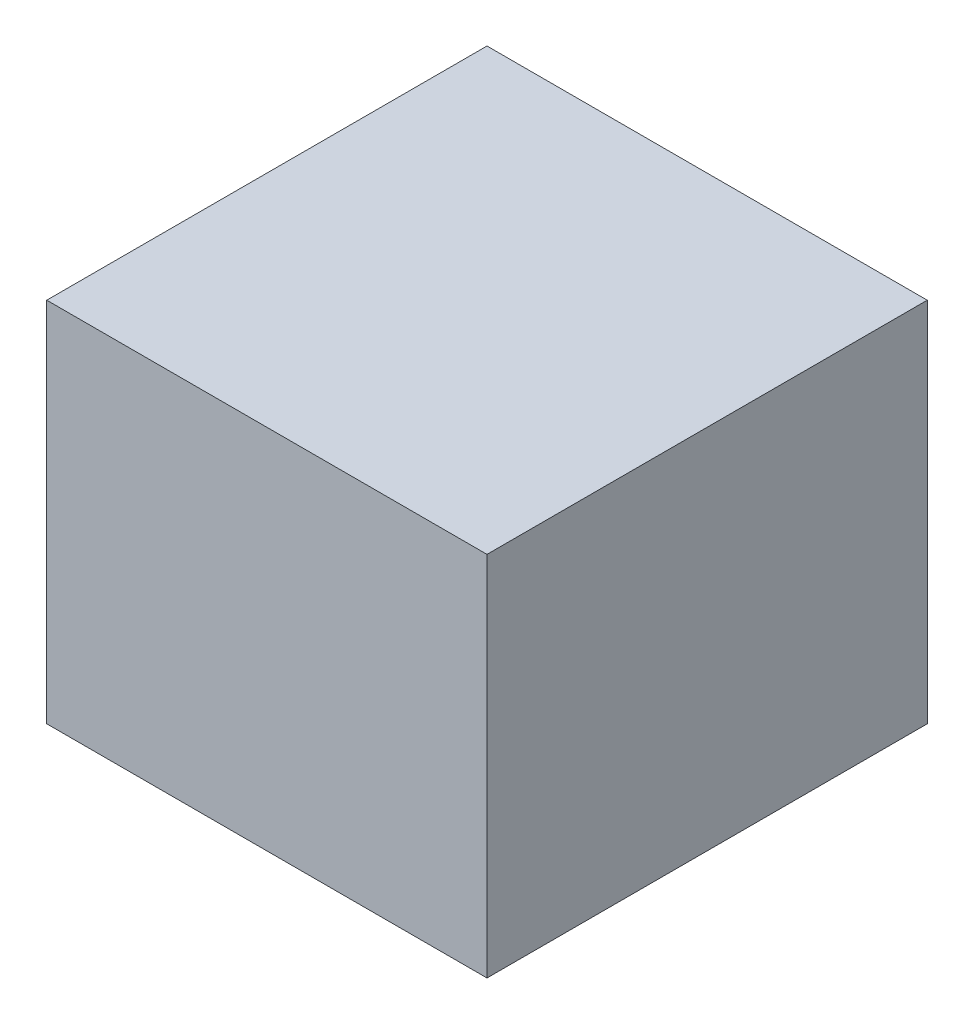
ISO-10303-21;
HEADER;
FILE_DESCRIPTION(('STEP AP214'),'2;1');
FILE_NAME('part.step','',(''),(''),'','','');
FILE_SCHEMA(('AUTOMOTIVE_DESIGN { 1 0 10303 214 1 1 1 1 }'));
ENDSEC;
DATA;
#1=APPLICATION_CONTEXT('core data for automotive mechanical design processes');
#2=APPLICATION_PROTOCOL_DEFINITION('international standard','automotive_design',2000,#1);
#3=PRODUCT_CONTEXT('',#1,'mechanical');
#4=PRODUCT('Part','Part','',(#3));
#5=PRODUCT_RELATED_PRODUCT_CATEGORY('part','',(#4));
#6=PRODUCT_DEFINITION_FORMATION('','',#4);
#7=PRODUCT_DEFINITION_CONTEXT('part definition',#1,'design');
#8=PRODUCT_DEFINITION('design','',#6,#7);
#9=PRODUCT_DEFINITION_SHAPE('','',#8);
#10=(LENGTH_UNIT() NAMED_UNIT(*) SI_UNIT(.MILLI.,.METRE.));
#11=(NAMED_UNIT(*) PLANE_ANGLE_UNIT() SI_UNIT($,.RADIAN.));
#12=(NAMED_UNIT(*) SI_UNIT($,.STERADIAN.) SOLID_ANGLE_UNIT());
#13=UNCERTAINTY_MEASURE_WITH_UNIT(LENGTH_MEASURE(1.E-05),#10,'distance_accuracy_value','');
#14=(GEOMETRIC_REPRESENTATION_CONTEXT(3) GLOBAL_UNCERTAINTY_ASSIGNED_CONTEXT((#13)) GLOBAL_UNIT_ASSIGNED_CONTEXT((#10,
#11,#12)) REPRESENTATION_CONTEXT('',''));
#15=CARTESIAN_POINT('',(0.,0.,0.));
#16=DIRECTION('',(0.,0.,1.));
#17=DIRECTION('',(1.,0.,0.));
#18=AXIS2_PLACEMENT_3D('',#15,#16,#17);
#19=CARTESIAN_POINT('',(0.,25.,0.));
#20=DIRECTION('',(1.,0.,0.));
#21=DIRECTION('',(0.,0.,-1.));
#22=AXIS2_PLACEMENT_3D('',#19,#20,#21);
#23=PLANE('',#22);
#24=DIRECTION('',(0.,0.,1.));
#25=VECTOR('',#24,1.);
#26=CARTESIAN_POINT('',(0.,0.,0.));
#27=LINE('',#26,#25);
#28=CARTESIAN_POINT('',(0.,0.,0.));
#29=VERTEX_POINT('',#28);
#30=CARTESIAN_POINT('',(0.,0.,30.));
#31=VERTEX_POINT('',#30);
#32=EDGE_CURVE('E107',#29,#31,#27,.T.);
#33=ORIENTED_EDGE('',*,*,#32,.T.);
#34=DIRECTION('',(0.,-1.,0.));
#35=VECTOR('',#34,1.);
#36=CARTESIAN_POINT('',(0.,25.,30.));
#37=LINE('',#36,#35);
#38=CARTESIAN_POINT('',(0.,25.,30.));
#39=VERTEX_POINT('',#38);
#40=EDGE_CURVE('E11',#39,#31,#37,.T.);
#41=ORIENTED_EDGE('',*,*,#40,.F.);
#42=DIRECTION('',(0.,0.,1.));
#43=VECTOR('',#42,1.);
#44=CARTESIAN_POINT('',(0.,25.,0.));
#45=LINE('',#44,#43);
#46=CARTESIAN_POINT('',(0.,25.,0.));
#47=VERTEX_POINT('',#46);
#48=EDGE_CURVE('E91',#47,#39,#45,.T.);
#49=ORIENTED_EDGE('',*,*,#48,.F.);
#50=DIRECTION('',(0.,-1.,0.));
#51=VECTOR('',#50,1.);
#52=CARTESIAN_POINT('',(0.,25.,0.));
#53=LINE('',#52,#51);
#54=EDGE_CURVE('E103',#47,#29,#53,.T.);
#55=ORIENTED_EDGE('',*,*,#54,.T.);
#56=EDGE_LOOP('',(#33,#41,#49,#55));
#57=FACE_BOUND('',#56,.T.);
#58=ADVANCED_FACE('F39',(#57),#23,.F.);
#59=CARTESIAN_POINT('',(0.,25.,30.));
#60=DIRECTION('',(0.,0.,-1.));
#61=DIRECTION('',(-1.,0.,0.));
#62=AXIS2_PLACEMENT_3D('',#59,#60,#61);
#63=PLANE('',#62);
#64=DIRECTION('',(1.,0.,0.));
#65=VECTOR('',#64,1.);
#66=CARTESIAN_POINT('',(0.,0.,30.));
#67=LINE('',#66,#65);
#68=CARTESIAN_POINT('',(30.,0.,30.));
#69=VERTEX_POINT('',#68);
#70=EDGE_CURVE('E96',#31,#69,#67,.T.);
#71=ORIENTED_EDGE('',*,*,#70,.T.);
#72=DIRECTION('',(0.,-1.,0.));
#73=VECTOR('',#72,1.);
#74=CARTESIAN_POINT('',(30.,25.,30.));
#75=LINE('',#74,#73);
#76=CARTESIAN_POINT('',(30.,25.,30.));
#77=VERTEX_POINT('',#76);
#78=EDGE_CURVE('E48',#77,#69,#75,.T.);
#79=ORIENTED_EDGE('',*,*,#78,.F.);
#80=DIRECTION('',(1.,0.,0.));
#81=VECTOR('',#80,1.);
#82=CARTESIAN_POINT('',(0.,25.,30.));
#83=LINE('',#82,#81);
#84=EDGE_CURVE('E86',#39,#77,#83,.T.);
#85=ORIENTED_EDGE('',*,*,#84,.F.);
#86=ORIENTED_EDGE('',*,*,#40,.T.);
#87=EDGE_LOOP('',(#71,#79,#85,#86));
#88=FACE_BOUND('',#87,.T.);
#89=ADVANCED_FACE('F95',(#88),#63,.F.);
#90=CARTESIAN_POINT('',(30.,25.,0.));
#91=DIRECTION('',(-1.,0.,0.));
#92=DIRECTION('',(0.,0.,1.));
#93=AXIS2_PLACEMENT_3D('',#90,#91,#92);
#94=PLANE('',#93);
#95=DIRECTION('',(0.,0.,-1.));
#96=VECTOR('',#95,1.);
#97=CARTESIAN_POINT('',(30.,0.,0.));
#98=LINE('',#97,#96);
#99=CARTESIAN_POINT('',(30.,0.,0.));
#100=VERTEX_POINT('',#99);
#101=EDGE_CURVE('E73',#69,#100,#98,.T.);
#102=ORIENTED_EDGE('',*,*,#101,.T.);
#103=DIRECTION('',(0.,-1.,0.));
#104=VECTOR('',#103,1.);
#105=CARTESIAN_POINT('',(30.,25.,0.));
#106=LINE('',#105,#104);
#107=CARTESIAN_POINT('',(30.,25.,0.));
#108=VERTEX_POINT('',#107);
#109=EDGE_CURVE('E98',#108,#100,#106,.T.);
#110=ORIENTED_EDGE('',*,*,#109,.F.);
#111=DIRECTION('',(0.,0.,-1.));
#112=VECTOR('',#111,1.);
#113=CARTESIAN_POINT('',(30.,25.,0.));
#114=LINE('',#113,#112);
#115=EDGE_CURVE('E89',#77,#108,#114,.T.);
#116=ORIENTED_EDGE('',*,*,#115,.F.);
#117=ORIENTED_EDGE('',*,*,#78,.T.);
#118=EDGE_LOOP('',(#102,#110,#116,#117));
#119=FACE_BOUND('',#118,.T.);
#120=ADVANCED_FACE('F99',(#119),#94,.F.);
#121=CARTESIAN_POINT('',(0.,25.,0.));
#122=DIRECTION('',(0.,0.,1.));
#123=DIRECTION('',(1.,0.,0.));
#124=AXIS2_PLACEMENT_3D('',#121,#122,#123);
#125=PLANE('',#124);
#126=DIRECTION('',(-1.,0.,0.));
#127=VECTOR('',#126,1.);
#128=CARTESIAN_POINT('',(0.,0.,0.));
#129=LINE('',#128,#127);
#130=EDGE_CURVE('E79',#100,#29,#129,.T.);
#131=ORIENTED_EDGE('',*,*,#130,.T.);
#132=ORIENTED_EDGE('',*,*,#54,.F.);
#133=DIRECTION('',(-1.,0.,0.));
#134=VECTOR('',#133,1.);
#135=CARTESIAN_POINT('',(0.,25.,0.));
#136=LINE('',#135,#134);
#137=EDGE_CURVE('E56',#108,#47,#136,.T.);
#138=ORIENTED_EDGE('',*,*,#137,.F.);
#139=ORIENTED_EDGE('',*,*,#109,.T.);
#140=EDGE_LOOP('',(#131,#132,#138,#139));
#141=FACE_BOUND('',#140,.T.);
#142=ADVANCED_FACE('F120',(#141),#125,.F.);
#143=CARTESIAN_POINT('',(0.,25.,0.));
#144=DIRECTION('',(0.,1.,0.));
#145=DIRECTION('',(0.,0.,1.));
#146=AXIS2_PLACEMENT_3D('',#143,#144,#145);
#147=PLANE('',#146);
#148=ORIENTED_EDGE('',*,*,#48,.T.);
#149=ORIENTED_EDGE('',*,*,#84,.T.);
#150=ORIENTED_EDGE('',*,*,#115,.T.);
#151=ORIENTED_EDGE('',*,*,#137,.T.);
#152=EDGE_LOOP('',(#148,#149,#150,#151));
#153=FACE_BOUND('',#152,.T.);
#154=ADVANCED_FACE('F87',(#153),#147,.T.);
#155=CARTESIAN_POINT('',(0.,0.,0.));
#156=DIRECTION('',(0.,1.,0.));
#157=DIRECTION('',(0.,0.,1.));
#158=AXIS2_PLACEMENT_3D('',#155,#156,#157);
#159=PLANE('',#158);
#160=ORIENTED_EDGE('',*,*,#32,.F.);
#161=ORIENTED_EDGE('',*,*,#130,.F.);
#162=ORIENTED_EDGE('',*,*,#101,.F.);
#163=ORIENTED_EDGE('',*,*,#70,.F.);
#164=EDGE_LOOP('',(#160,#161,#162,#163));
#165=FACE_BOUND('',#164,.T.);
#166=ADVANCED_FACE('F123',(#165),#159,.F.);
#167=CLOSED_SHELL('',(#58,#89,#120,#142,#154,#166));
#168=MANIFOLD_SOLID_BREP('B2',#167);
#169=ADVANCED_BREP_SHAPE_REPRESENTATION('',(#18,#168),#14);
#170=SHAPE_DEFINITION_REPRESENTATION(#9,#169);
ENDSEC;
END-ISO-10303-21;
